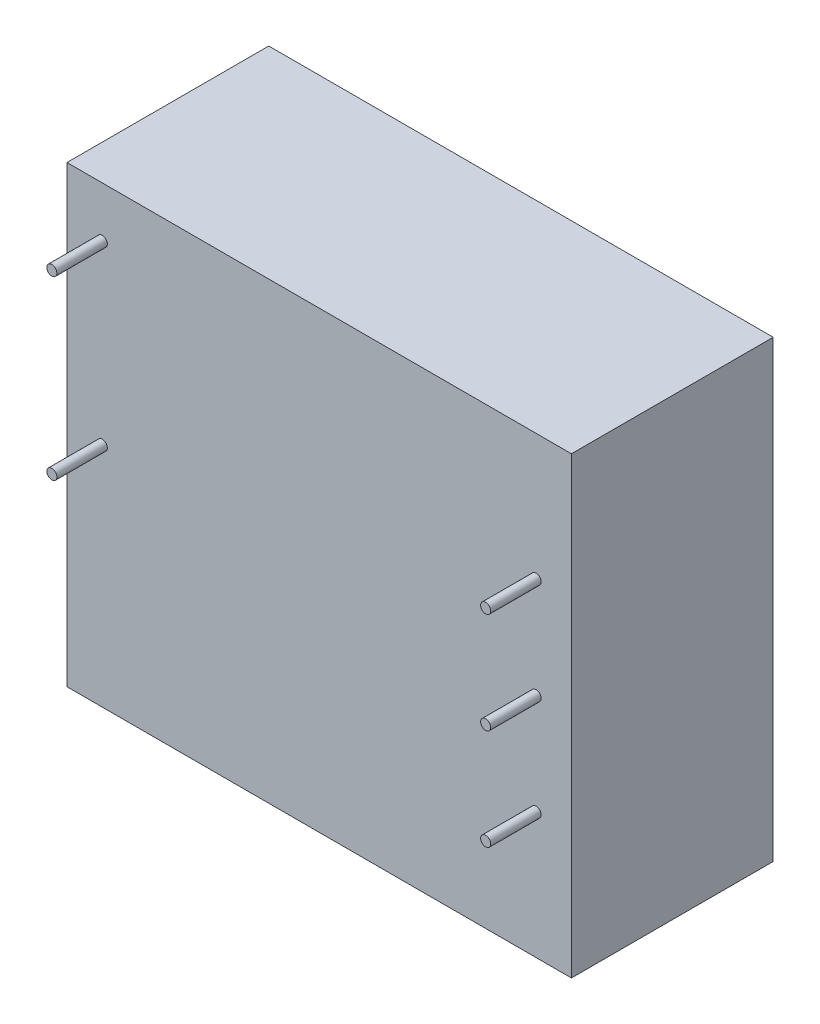
ISO-10303-21;
HEADER;
FILE_DESCRIPTION(('STEP AP214'),'2;1');
FILE_NAME('part.step','',(''),(''),'','','');
FILE_SCHEMA(('AUTOMOTIVE_DESIGN { 1 0 10303 214 1 1 1 1 }'));
ENDSEC;
DATA;
#1=APPLICATION_CONTEXT('core data for automotive mechanical design processes');
#2=APPLICATION_PROTOCOL_DEFINITION('international standard','automotive_design',2000,#1);
#3=PRODUCT_CONTEXT('',#1,'mechanical');
#4=PRODUCT('Part','Part','',(#3));
#5=PRODUCT_RELATED_PRODUCT_CATEGORY('part','',(#4));
#6=PRODUCT_DEFINITION_FORMATION('','',#4);
#7=PRODUCT_DEFINITION_CONTEXT('part definition',#1,'design');
#8=PRODUCT_DEFINITION('design','',#6,#7);
#9=PRODUCT_DEFINITION_SHAPE('','',#8);
#10=(LENGTH_UNIT() NAMED_UNIT(*) SI_UNIT(.MILLI.,.METRE.));
#11=(NAMED_UNIT(*) PLANE_ANGLE_UNIT() SI_UNIT($,.RADIAN.));
#12=(NAMED_UNIT(*) SI_UNIT($,.STERADIAN.) SOLID_ANGLE_UNIT());
#13=UNCERTAINTY_MEASURE_WITH_UNIT(LENGTH_MEASURE(1.E-05),#10,'distance_accuracy_value','');
#14=(GEOMETRIC_REPRESENTATION_CONTEXT(3) GLOBAL_UNCERTAINTY_ASSIGNED_CONTEXT((#13)) GLOBAL_UNIT_ASSIGNED_CONTEXT((#10,
#11,#12)) REPRESENTATION_CONTEXT('',''));
#15=CARTESIAN_POINT('',(0.,0.,0.));
#16=DIRECTION('',(0.,0.,1.));
#17=DIRECTION('',(1.,0.,0.));
#18=AXIS2_PLACEMENT_3D('',#15,#16,#17);
#19=CARTESIAN_POINT('',(-25.,-22.5,20.));
#20=DIRECTION('',(0.,0.,-1.));
#21=DIRECTION('',(-1.,0.,0.));
#22=AXIS2_PLACEMENT_3D('',#19,#20,#21);
#23=PLANE('',#22);
#24=CARTESIAN_POINT('',(21.5,10.,20.));
#25=DIRECTION('',(0.,0.,-1.));
#26=DIRECTION('',(-1.,0.,0.));
#27=AXIS2_PLACEMENT_3D('',#24,#25,#26);
#28=CIRCLE('',#27,0.499999999999999);
#29=CARTESIAN_POINT('',(21.,10.,20.));
#30=VERTEX_POINT('',#29);
#31=EDGE_CURVE('E36',#30,#30,#28,.F.);
#32=ORIENTED_EDGE('',*,*,#31,.F.);
#33=EDGE_LOOP('',(#32));
#34=FACE_BOUND('',#33,.T.);
#35=CARTESIAN_POINT('',(-21.5,0.,20.));
#36=DIRECTION('',(0.,0.,-1.));
#37=DIRECTION('',(-1.,0.,0.));
#38=AXIS2_PLACEMENT_3D('',#35,#36,#37);
#39=CIRCLE('',#38,0.499999999999999);
#40=CARTESIAN_POINT('',(-22.,0.,20.));
#41=VERTEX_POINT('',#40);
#42=EDGE_CURVE('E113',#41,#41,#39,.F.);
#43=ORIENTED_EDGE('',*,*,#42,.F.);
#44=EDGE_LOOP('',(#43));
#45=FACE_BOUND('',#44,.T.);
#46=DIRECTION('',(0.,-1.,0.));
#47=VECTOR('',#46,1.);
#48=CARTESIAN_POINT('',(-25.,-22.5,20.));
#49=LINE('',#48,#47);
#50=CARTESIAN_POINT('',(-25.,22.5,20.));
#51=VERTEX_POINT('',#50);
#52=CARTESIAN_POINT('',(-25.,-22.5,20.));
#53=VERTEX_POINT('',#52);
#54=EDGE_CURVE('E101',#51,#53,#49,.T.);
#55=ORIENTED_EDGE('',*,*,#54,.T.);
#56=DIRECTION('',(1.,0.,0.));
#57=VECTOR('',#56,1.);
#58=CARTESIAN_POINT('',(-25.,-22.5,20.));
#59=LINE('',#58,#57);
#60=CARTESIAN_POINT('',(25.,-22.5,20.));
#61=VERTEX_POINT('',#60);
#62=EDGE_CURVE('E83',#53,#61,#59,.T.);
#63=ORIENTED_EDGE('',*,*,#62,.T.);
#64=DIRECTION('',(0.,1.,0.));
#65=VECTOR('',#64,1.);
#66=CARTESIAN_POINT('',(25.,-22.5,20.));
#67=LINE('',#66,#65);
#68=CARTESIAN_POINT('',(25.,22.5,20.));
#69=VERTEX_POINT('',#68);
#70=EDGE_CURVE('E48',#61,#69,#67,.T.);
#71=ORIENTED_EDGE('',*,*,#70,.T.);
#72=DIRECTION('',(-1.,0.,0.));
#73=VECTOR('',#72,1.);
#74=CARTESIAN_POINT('',(-25.,22.5,20.));
#75=LINE('',#74,#73);
#76=EDGE_CURVE('E43',#69,#51,#75,.T.);
#77=ORIENTED_EDGE('',*,*,#76,.T.);
#78=EDGE_LOOP('',(#55,#63,#71,#77));
#79=FACE_BOUND('',#78,.T.);
#80=CARTESIAN_POINT('',(-21.5,17.5,20.));
#81=DIRECTION('',(0.,0.,-1.));
#82=DIRECTION('',(-1.,0.,0.));
#83=AXIS2_PLACEMENT_3D('',#80,#81,#82);
#84=CIRCLE('',#83,0.499999999999999);
#85=CARTESIAN_POINT('',(-22.,17.5,20.));
#86=VERTEX_POINT('',#85);
#87=EDGE_CURVE('E86',#86,#86,#84,.F.);
#88=ORIENTED_EDGE('',*,*,#87,.F.);
#89=EDGE_LOOP('',(#88));
#90=FACE_BOUND('',#89,.T.);
#91=CARTESIAN_POINT('',(21.5,0.,20.));
#92=DIRECTION('',(0.,0.,-1.));
#93=DIRECTION('',(-1.,0.,0.));
#94=AXIS2_PLACEMENT_3D('',#91,#92,#93);
#95=CIRCLE('',#94,0.499999999999999);
#96=CARTESIAN_POINT('',(21.,0.,20.));
#97=VERTEX_POINT('',#96);
#98=EDGE_CURVE('E116',#97,#97,#95,.F.);
#99=ORIENTED_EDGE('',*,*,#98,.F.);
#100=EDGE_LOOP('',(#99));
#101=FACE_BOUND('',#100,.T.);
#102=CARTESIAN_POINT('',(21.5,-10.,20.));
#103=DIRECTION('',(0.,0.,-1.));
#104=DIRECTION('',(-1.,0.,0.));
#105=AXIS2_PLACEMENT_3D('',#102,#103,#104);
#106=CIRCLE('',#105,0.499999999999999);
#107=CARTESIAN_POINT('',(21.,-10.,20.));
#108=VERTEX_POINT('',#107);
#109=EDGE_CURVE('E11',#108,#108,#106,.F.);
#110=ORIENTED_EDGE('',*,*,#109,.F.);
#111=EDGE_LOOP('',(#110));
#112=FACE_BOUND('',#111,.T.);
#113=ADVANCED_FACE('F28',(#34,#45,#79,#90,#101,#112),#23,.F.);
#114=CARTESIAN_POINT('',(-25.,-22.5,20.));
#115=DIRECTION('',(1.,0.,0.));
#116=DIRECTION('',(0.,1.,0.));
#117=AXIS2_PLACEMENT_3D('',#114,#115,#116);
#118=PLANE('',#117);
#119=DIRECTION('',(0.,-1.,0.));
#120=VECTOR('',#119,1.);
#121=CARTESIAN_POINT('',(-25.,-22.5,0.));
#122=LINE('',#121,#120);
#123=CARTESIAN_POINT('',(-25.,22.5,0.));
#124=VERTEX_POINT('',#123);
#125=CARTESIAN_POINT('',(-25.,-22.5,0.));
#126=VERTEX_POINT('',#125);
#127=EDGE_CURVE('E74',#124,#126,#122,.T.);
#128=ORIENTED_EDGE('',*,*,#127,.T.);
#129=DIRECTION('',(0.,0.,-1.));
#130=VECTOR('',#129,1.);
#131=CARTESIAN_POINT('',(-25.,-22.5,20.));
#132=LINE('',#131,#130);
#133=EDGE_CURVE('E81',#53,#126,#132,.T.);
#134=ORIENTED_EDGE('',*,*,#133,.F.);
#135=ORIENTED_EDGE('',*,*,#54,.F.);
#136=DIRECTION('',(0.,0.,-1.));
#137=VECTOR('',#136,1.);
#138=CARTESIAN_POINT('',(-25.,22.5,20.));
#139=LINE('',#138,#137);
#140=EDGE_CURVE('E90',#51,#124,#139,.T.);
#141=ORIENTED_EDGE('',*,*,#140,.T.);
#142=EDGE_LOOP('',(#128,#134,#135,#141));
#143=FACE_BOUND('',#142,.T.);
#144=ADVANCED_FACE('F30',(#143),#118,.F.);
#145=CARTESIAN_POINT('',(-25.,-22.5,20.));
#146=DIRECTION('',(0.,1.,0.));
#147=DIRECTION('',(-1.,0.,0.));
#148=AXIS2_PLACEMENT_3D('',#145,#146,#147);
#149=PLANE('',#148);
#150=DIRECTION('',(1.,0.,0.));
#151=VECTOR('',#150,1.);
#152=CARTESIAN_POINT('',(-25.,-22.5,0.));
#153=LINE('',#152,#151);
#154=CARTESIAN_POINT('',(25.,-22.5,0.));
#155=VERTEX_POINT('',#154);
#156=EDGE_CURVE('E69',#126,#155,#153,.T.);
#157=ORIENTED_EDGE('',*,*,#156,.T.);
#158=DIRECTION('',(0.,0.,-1.));
#159=VECTOR('',#158,1.);
#160=CARTESIAN_POINT('',(25.,-22.5,20.));
#161=LINE('',#160,#159);
#162=EDGE_CURVE('E87',#61,#155,#161,.T.);
#163=ORIENTED_EDGE('',*,*,#162,.F.);
#164=ORIENTED_EDGE('',*,*,#62,.F.);
#165=ORIENTED_EDGE('',*,*,#133,.T.);
#166=EDGE_LOOP('',(#157,#163,#164,#165));
#167=FACE_BOUND('',#166,.T.);
#168=ADVANCED_FACE('F82',(#167),#149,.F.);
#169=CARTESIAN_POINT('',(25.,-22.5,20.));
#170=DIRECTION('',(-1.,0.,0.));
#171=DIRECTION('',(0.,-1.,0.));
#172=AXIS2_PLACEMENT_3D('',#169,#170,#171);
#173=PLANE('',#172);
#174=DIRECTION('',(0.,1.,0.));
#175=VECTOR('',#174,1.);
#176=CARTESIAN_POINT('',(25.,-22.5,0.));
#177=LINE('',#176,#175);
#178=CARTESIAN_POINT('',(25.,22.5,0.));
#179=VERTEX_POINT('',#178);
#180=EDGE_CURVE('E75',#155,#179,#177,.T.);
#181=ORIENTED_EDGE('',*,*,#180,.T.);
#182=DIRECTION('',(0.,0.,-1.));
#183=VECTOR('',#182,1.);
#184=CARTESIAN_POINT('',(25.,22.5,20.));
#185=LINE('',#184,#183);
#186=EDGE_CURVE('E107',#69,#179,#185,.T.);
#187=ORIENTED_EDGE('',*,*,#186,.F.);
#188=ORIENTED_EDGE('',*,*,#70,.F.);
#189=ORIENTED_EDGE('',*,*,#162,.T.);
#190=EDGE_LOOP('',(#181,#187,#188,#189));
#191=FACE_BOUND('',#190,.T.);
#192=ADVANCED_FACE('F182',(#191),#173,.F.);
#193=CARTESIAN_POINT('',(-25.,22.5,20.));
#194=DIRECTION('',(0.,-1.,0.));
#195=DIRECTION('',(1.,0.,0.));
#196=AXIS2_PLACEMENT_3D('',#193,#194,#195);
#197=PLANE('',#196);
#198=DIRECTION('',(-1.,0.,0.));
#199=VECTOR('',#198,1.);
#200=CARTESIAN_POINT('',(-25.,22.5,0.));
#201=LINE('',#200,#199);
#202=EDGE_CURVE('E99',#179,#124,#201,.T.);
#203=ORIENTED_EDGE('',*,*,#202,.T.);
#204=ORIENTED_EDGE('',*,*,#140,.F.);
#205=ORIENTED_EDGE('',*,*,#76,.F.);
#206=ORIENTED_EDGE('',*,*,#186,.T.);
#207=EDGE_LOOP('',(#203,#204,#205,#206));
#208=FACE_BOUND('',#207,.T.);
#209=ADVANCED_FACE('F178',(#208),#197,.F.);
#210=CARTESIAN_POINT('',(-25.,-22.5,0.));
#211=DIRECTION('',(0.,0.,-1.));
#212=DIRECTION('',(-1.,0.,0.));
#213=AXIS2_PLACEMENT_3D('',#210,#211,#212);
#214=PLANE('',#213);
#215=ORIENTED_EDGE('',*,*,#127,.F.);
#216=ORIENTED_EDGE('',*,*,#202,.F.);
#217=ORIENTED_EDGE('',*,*,#180,.F.);
#218=ORIENTED_EDGE('',*,*,#156,.F.);
#219=EDGE_LOOP('',(#215,#216,#217,#218));
#220=FACE_BOUND('',#219,.T.);
#221=ADVANCED_FACE('F71',(#220),#214,.T.);
#222=CARTESIAN_POINT('',(-21.5,17.5,25.));
#223=DIRECTION('',(0.,0.,-1.));
#224=DIRECTION('',(-1.,0.,0.));
#225=AXIS2_PLACEMENT_3D('',#222,#223,#224);
#226=CYLINDRICAL_SURFACE('',#225,0.499999999999999);
#227=CARTESIAN_POINT('',(-21.5,17.5,25.));
#228=DIRECTION('',(0.,0.,1.));
#229=DIRECTION('',(1.,0.,0.));
#230=AXIS2_PLACEMENT_3D('',#227,#228,#229);
#231=CIRCLE('',#230,0.499999999999999);
#232=CARTESIAN_POINT('',(-21.,17.5,25.));
#233=VERTEX_POINT('',#232);
#234=EDGE_CURVE('E91',#233,#233,#231,.T.);
#235=ORIENTED_EDGE('',*,*,#234,.F.);
#236=EDGE_LOOP('',(#235));
#237=FACE_BOUND('',#236,.T.);
#238=ORIENTED_EDGE('',*,*,#87,.T.);
#239=EDGE_LOOP('',(#238));
#240=FACE_BOUND('',#239,.T.);
#241=ADVANCED_FACE('F172',(#237,#240),#226,.T.);
#242=CARTESIAN_POINT('',(-21.5,17.5,25.));
#243=DIRECTION('',(0.,0.,1.));
#244=DIRECTION('',(1.,0.,0.));
#245=AXIS2_PLACEMENT_3D('',#242,#243,#244);
#246=PLANE('',#245);
#247=ORIENTED_EDGE('',*,*,#234,.T.);
#248=EDGE_LOOP('',(#247));
#249=FACE_BOUND('',#248,.T.);
#250=ADVANCED_FACE('F168',(#249),#246,.T.);
#251=CARTESIAN_POINT('',(-21.5,0.,25.));
#252=DIRECTION('',(0.,0.,-1.));
#253=DIRECTION('',(-1.,0.,0.));
#254=AXIS2_PLACEMENT_3D('',#251,#252,#253);
#255=CYLINDRICAL_SURFACE('',#254,0.499999999999999);
#256=CARTESIAN_POINT('',(-21.5,0.,25.));
#257=DIRECTION('',(0.,0.,1.));
#258=DIRECTION('',(1.,0.,0.));
#259=AXIS2_PLACEMENT_3D('',#256,#257,#258);
#260=CIRCLE('',#259,0.499999999999999);
#261=CARTESIAN_POINT('',(-21.,0.,25.));
#262=VERTEX_POINT('',#261);
#263=EDGE_CURVE('E94',#262,#262,#260,.T.);
#264=ORIENTED_EDGE('',*,*,#263,.F.);
#265=EDGE_LOOP('',(#264));
#266=FACE_BOUND('',#265,.T.);
#267=ORIENTED_EDGE('',*,*,#42,.T.);
#268=EDGE_LOOP('',(#267));
#269=FACE_BOUND('',#268,.T.);
#270=ADVANCED_FACE('F164',(#266,#269),#255,.T.);
#271=CARTESIAN_POINT('',(-21.5,0.,25.));
#272=DIRECTION('',(0.,0.,1.));
#273=DIRECTION('',(1.,0.,0.));
#274=AXIS2_PLACEMENT_3D('',#271,#272,#273);
#275=PLANE('',#274);
#276=ORIENTED_EDGE('',*,*,#263,.T.);
#277=EDGE_LOOP('',(#276));
#278=FACE_BOUND('',#277,.T.);
#279=ADVANCED_FACE('F160',(#278),#275,.T.);
#280=CARTESIAN_POINT('',(21.5,0.,25.));
#281=DIRECTION('',(0.,0.,-1.));
#282=DIRECTION('',(-1.,0.,0.));
#283=AXIS2_PLACEMENT_3D('',#280,#281,#282);
#284=CYLINDRICAL_SURFACE('',#283,0.499999999999999);
#285=CARTESIAN_POINT('',(21.5,0.,25.));
#286=DIRECTION('',(0.,0.,1.));
#287=DIRECTION('',(1.,0.,0.));
#288=AXIS2_PLACEMENT_3D('',#285,#286,#287);
#289=CIRCLE('',#288,0.499999999999999);
#290=CARTESIAN_POINT('',(22.,0.,25.));
#291=VERTEX_POINT('',#290);
#292=EDGE_CURVE('E287',#291,#291,#289,.T.);
#293=ORIENTED_EDGE('',*,*,#292,.F.);
#294=EDGE_LOOP('',(#293));
#295=FACE_BOUND('',#294,.T.);
#296=ORIENTED_EDGE('',*,*,#98,.T.);
#297=EDGE_LOOP('',(#296));
#298=FACE_BOUND('',#297,.T.);
#299=ADVANCED_FACE('F156',(#295,#298),#284,.T.);
#300=CARTESIAN_POINT('',(21.5,0.,25.));
#301=DIRECTION('',(0.,0.,1.));
#302=DIRECTION('',(1.,0.,0.));
#303=AXIS2_PLACEMENT_3D('',#300,#301,#302);
#304=PLANE('',#303);
#305=ORIENTED_EDGE('',*,*,#292,.T.);
#306=EDGE_LOOP('',(#305));
#307=FACE_BOUND('',#306,.T.);
#308=ADVANCED_FACE('F152',(#307),#304,.T.);
#309=CARTESIAN_POINT('',(21.5,10.,25.));
#310=DIRECTION('',(0.,0.,-1.));
#311=DIRECTION('',(-1.,0.,0.));
#312=AXIS2_PLACEMENT_3D('',#309,#310,#311);
#313=CYLINDRICAL_SURFACE('',#312,0.499999999999999);
#314=CARTESIAN_POINT('',(21.5,10.,25.));
#315=DIRECTION('',(0.,0.,1.));
#316=DIRECTION('',(1.,0.,0.));
#317=AXIS2_PLACEMENT_3D('',#314,#315,#316);
#318=CIRCLE('',#317,0.499999999999999);
#319=CARTESIAN_POINT('',(22.,10.,25.));
#320=VERTEX_POINT('',#319);
#321=EDGE_CURVE('E289',#320,#320,#318,.T.);
#322=ORIENTED_EDGE('',*,*,#321,.F.);
#323=EDGE_LOOP('',(#322));
#324=FACE_BOUND('',#323,.T.);
#325=ORIENTED_EDGE('',*,*,#31,.T.);
#326=EDGE_LOOP('',(#325));
#327=FACE_BOUND('',#326,.T.);
#328=ADVANCED_FACE('F121',(#324,#327),#313,.T.);
#329=CARTESIAN_POINT('',(21.5,10.,25.));
#330=DIRECTION('',(0.,0.,1.));
#331=DIRECTION('',(1.,0.,0.));
#332=AXIS2_PLACEMENT_3D('',#329,#330,#331);
#333=PLANE('',#332);
#334=ORIENTED_EDGE('',*,*,#321,.T.);
#335=EDGE_LOOP('',(#334));
#336=FACE_BOUND('',#335,.T.);
#337=ADVANCED_FACE('F137',(#336),#333,.T.);
#338=CARTESIAN_POINT('',(21.5,-10.,25.));
#339=DIRECTION('',(0.,0.,-1.));
#340=DIRECTION('',(-1.,0.,0.));
#341=AXIS2_PLACEMENT_3D('',#338,#339,#340);
#342=CYLINDRICAL_SURFACE('',#341,0.499999999999999);
#343=CARTESIAN_POINT('',(21.5,-10.,25.));
#344=DIRECTION('',(0.,0.,1.));
#345=DIRECTION('',(1.,0.,0.));
#346=AXIS2_PLACEMENT_3D('',#343,#344,#345);
#347=CIRCLE('',#346,0.499999999999999);
#348=CARTESIAN_POINT('',(22.,-10.,25.));
#349=VERTEX_POINT('',#348);
#350=EDGE_CURVE('E294',#349,#349,#347,.T.);
#351=ORIENTED_EDGE('',*,*,#350,.F.);
#352=EDGE_LOOP('',(#351));
#353=FACE_BOUND('',#352,.T.);
#354=ORIENTED_EDGE('',*,*,#109,.T.);
#355=EDGE_LOOP('',(#354));
#356=FACE_BOUND('',#355,.T.);
#357=ADVANCED_FACE('F134',(#353,#356),#342,.T.);
#358=CARTESIAN_POINT('',(21.5,-10.,25.));
#359=DIRECTION('',(0.,0.,1.));
#360=DIRECTION('',(1.,0.,0.));
#361=AXIS2_PLACEMENT_3D('',#358,#359,#360);
#362=PLANE('',#361);
#363=ORIENTED_EDGE('',*,*,#350,.T.);
#364=EDGE_LOOP('',(#363));
#365=FACE_BOUND('',#364,.T.);
#366=ADVANCED_FACE('F136',(#365),#362,.T.);
#367=CLOSED_SHELL('',(#113,#144,#168,#192,#209,#221,#241,#250,#270,#279,#299,#308,#328,#337,
#357,#366));
#368=MANIFOLD_SOLID_BREP('B2',#367);
#369=ADVANCED_BREP_SHAPE_REPRESENTATION('',(#18,#368),#14);
#370=SHAPE_DEFINITION_REPRESENTATION(#9,#369);
ENDSEC;
END-ISO-10303-21;
